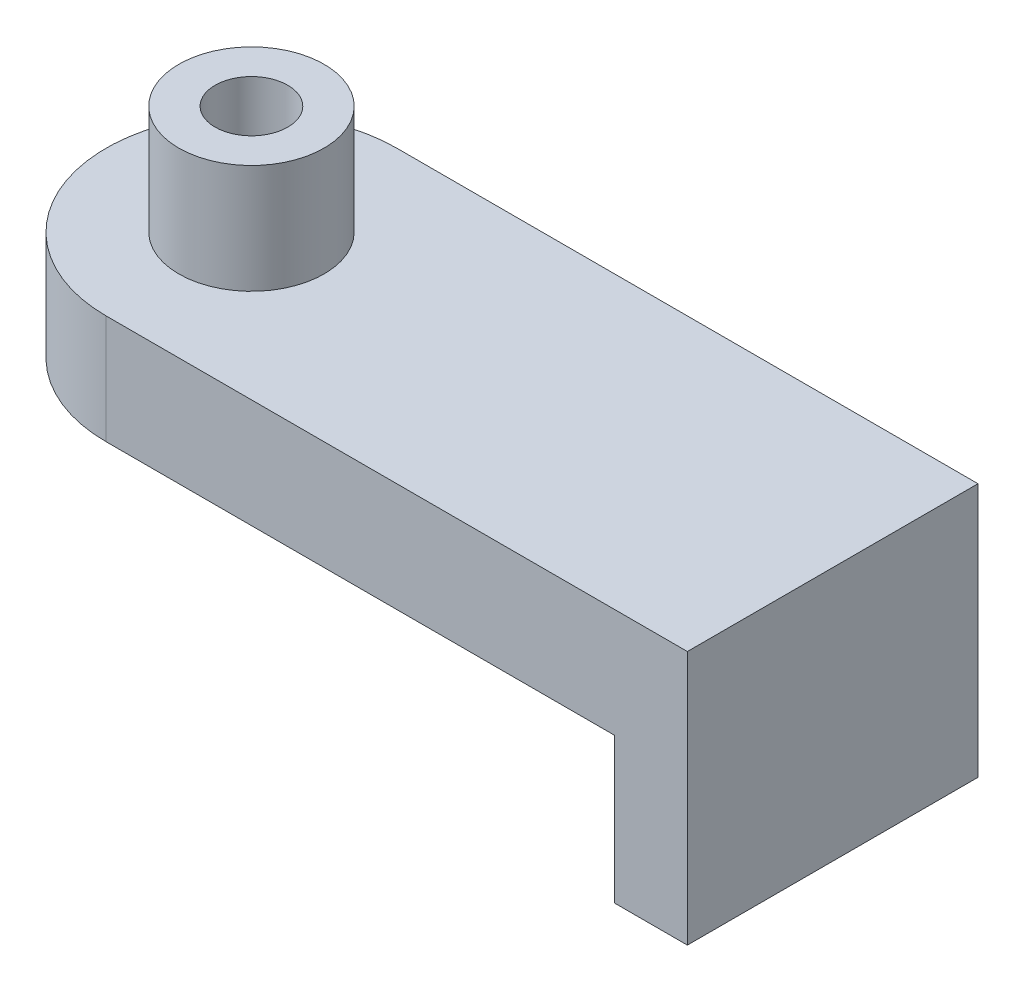
ISO-10303-21;
HEADER;
FILE_DESCRIPTION(('STEP AP214'),'2;1');
FILE_NAME('part.step','',(''),(''),'','','');
FILE_SCHEMA(('AUTOMOTIVE_DESIGN { 1 0 10303 214 1 1 1 1 }'));
ENDSEC;
DATA;
#1=APPLICATION_CONTEXT('core data for automotive mechanical design processes');
#2=APPLICATION_PROTOCOL_DEFINITION('international standard','automotive_design',2000,#1);
#3=PRODUCT_CONTEXT('',#1,'mechanical');
#4=PRODUCT('Part','Part','',(#3));
#5=PRODUCT_RELATED_PRODUCT_CATEGORY('part','',(#4));
#6=PRODUCT_DEFINITION_FORMATION('','',#4);
#7=PRODUCT_DEFINITION_CONTEXT('part definition',#1,'design');
#8=PRODUCT_DEFINITION('design','',#6,#7);
#9=PRODUCT_DEFINITION_SHAPE('','',#8);
#10=(LENGTH_UNIT() NAMED_UNIT(*) SI_UNIT(.MILLI.,.METRE.));
#11=(NAMED_UNIT(*) PLANE_ANGLE_UNIT() SI_UNIT($,.RADIAN.));
#12=(NAMED_UNIT(*) SI_UNIT($,.STERADIAN.) SOLID_ANGLE_UNIT());
#13=UNCERTAINTY_MEASURE_WITH_UNIT(LENGTH_MEASURE(1.E-05),#10,'distance_accuracy_value','');
#14=(GEOMETRIC_REPRESENTATION_CONTEXT(3) GLOBAL_UNCERTAINTY_ASSIGNED_CONTEXT((#13)) GLOBAL_UNIT_ASSIGNED_CONTEXT((#10,
#11,#12)) REPRESENTATION_CONTEXT('',''));
#15=CARTESIAN_POINT('',(0.,0.,0.));
#16=DIRECTION('',(0.,0.,1.));
#17=DIRECTION('',(1.,0.,0.));
#18=AXIS2_PLACEMENT_3D('',#15,#16,#17);
#19=CARTESIAN_POINT('',(-40.,0.,0.));
#20=DIRECTION('',(0.,1.,0.));
#21=DIRECTION('',(0.,0.,1.));
#22=AXIS2_PLACEMENT_3D('',#19,#20,#21);
#23=PLANE('',#22);
#24=CARTESIAN_POINT('',(-40.,0.,0.));
#25=DIRECTION('',(0.,1.,0.));
#26=DIRECTION('',(0.,0.,1.));
#27=AXIS2_PLACEMENT_3D('',#24,#25,#26);
#28=CIRCLE('',#27,5.);
#29=CARTESIAN_POINT('',(-40.,0.,5.));
#30=VERTEX_POINT('',#29);
#31=EDGE_CURVE('E133',#30,#30,#28,.T.);
#32=ORIENTED_EDGE('',*,*,#31,.T.);
#33=EDGE_LOOP('',(#32));
#34=FACE_BOUND('',#33,.T.);
#35=DIRECTION('',(0.,0.,-1.));
#36=VECTOR('',#35,1.);
#37=CARTESIAN_POINT('',(30.,0.,20.));
#38=LINE('',#37,#36);
#39=CARTESIAN_POINT('',(30.,0.,20.));
#40=VERTEX_POINT('',#39);
#41=CARTESIAN_POINT('',(30.,0.,-20.));
#42=VERTEX_POINT('',#41);
#43=EDGE_CURVE('E52',#40,#42,#38,.T.);
#44=ORIENTED_EDGE('',*,*,#43,.F.);
#45=DIRECTION('',(1.,0.,0.));
#46=VECTOR('',#45,1.);
#47=CARTESIAN_POINT('',(-40.,0.,20.));
#48=LINE('',#47,#46);
#49=CARTESIAN_POINT('',(-40.,0.,20.));
#50=VERTEX_POINT('',#49);
#51=EDGE_CURVE('E147',#50,#40,#48,.T.);
#52=ORIENTED_EDGE('',*,*,#51,.F.);
#53=CARTESIAN_POINT('',(-40.,0.,0.));
#54=DIRECTION('',(0.,1.,0.));
#55=DIRECTION('',(0.,0.,1.));
#56=AXIS2_PLACEMENT_3D('',#53,#54,#55);
#57=CIRCLE('',#56,20.);
#58=CARTESIAN_POINT('',(-40.,0.,-20.));
#59=VERTEX_POINT('',#58);
#60=EDGE_CURVE('E138',#59,#50,#57,.T.);
#61=ORIENTED_EDGE('',*,*,#60,.F.);
#62=DIRECTION('',(-1.,0.,0.));
#63=VECTOR('',#62,1.);
#64=CARTESIAN_POINT('',(-40.,0.,-20.));
#65=LINE('',#64,#63);
#66=EDGE_CURVE('E74',#42,#59,#65,.T.);
#67=ORIENTED_EDGE('',*,*,#66,.F.);
#68=EDGE_LOOP('',(#44,#52,#61,#67));
#69=FACE_BOUND('',#68,.T.);
#70=ADVANCED_FACE('F37',(#34,#69),#23,.F.);
#71=CARTESIAN_POINT('',(-40.,15.,0.));
#72=DIRECTION('',(0.,1.,0.));
#73=DIRECTION('',(0.,0.,1.));
#74=AXIS2_PLACEMENT_3D('',#71,#72,#73);
#75=PLANE('',#74);
#76=CARTESIAN_POINT('',(-40.,15.,0.));
#77=DIRECTION('',(0.,1.,0.));
#78=DIRECTION('',(0.,0.,1.));
#79=AXIS2_PLACEMENT_3D('',#76,#77,#78);
#80=CIRCLE('',#79,20.);
#81=CARTESIAN_POINT('',(-40.,15.,-20.));
#82=VERTEX_POINT('',#81);
#83=CARTESIAN_POINT('',(-40.,15.,20.));
#84=VERTEX_POINT('',#83);
#85=EDGE_CURVE('E139',#82,#84,#80,.T.);
#86=ORIENTED_EDGE('',*,*,#85,.T.);
#87=DIRECTION('',(1.,0.,0.));
#88=VECTOR('',#87,1.);
#89=CARTESIAN_POINT('',(-40.,15.,20.));
#90=LINE('',#89,#88);
#91=CARTESIAN_POINT('',(40.,15.,20.));
#92=VERTEX_POINT('',#91);
#93=EDGE_CURVE('E81',#84,#92,#90,.T.);
#94=ORIENTED_EDGE('',*,*,#93,.T.);
#95=DIRECTION('',(0.,0.,-1.));
#96=VECTOR('',#95,1.);
#97=CARTESIAN_POINT('',(40.,15.,-20.));
#98=LINE('',#97,#96);
#99=CARTESIAN_POINT('',(40.,15.,-20.));
#100=VERTEX_POINT('',#99);
#101=EDGE_CURVE('E103',#92,#100,#98,.T.);
#102=ORIENTED_EDGE('',*,*,#101,.T.);
#103=DIRECTION('',(-1.,0.,0.));
#104=VECTOR('',#103,1.);
#105=CARTESIAN_POINT('',(-40.,15.,-20.));
#106=LINE('',#105,#104);
#107=EDGE_CURVE('E61',#100,#82,#106,.T.);
#108=ORIENTED_EDGE('',*,*,#107,.T.);
#109=EDGE_LOOP('',(#86,#94,#102,#108));
#110=FACE_BOUND('',#109,.T.);
#111=CARTESIAN_POINT('',(-40.,15.,0.));
#112=DIRECTION('',(0.,1.,0.));
#113=DIRECTION('',(0.,0.,1.));
#114=AXIS2_PLACEMENT_3D('',#111,#112,#113);
#115=CIRCLE('',#114,10.);
#116=CARTESIAN_POINT('',(-40.,15.,10.));
#117=VERTEX_POINT('',#116);
#118=EDGE_CURVE('E129',#117,#117,#115,.T.);
#119=ORIENTED_EDGE('',*,*,#118,.F.);
#120=EDGE_LOOP('',(#119));
#121=FACE_BOUND('',#120,.T.);
#122=ADVANCED_FACE('F156',(#110,#121),#75,.T.);
#123=CARTESIAN_POINT('',(-40.,15.,0.));
#124=DIRECTION('',(0.,-1.,0.));
#125=DIRECTION('',(0.,0.,-1.));
#126=AXIS2_PLACEMENT_3D('',#123,#124,#125);
#127=CYLINDRICAL_SURFACE('',#126,20.);
#128=ORIENTED_EDGE('',*,*,#60,.T.);
#129=DIRECTION('',(0.,-1.,0.));
#130=VECTOR('',#129,1.);
#131=CARTESIAN_POINT('',(-40.,15.,20.));
#132=LINE('',#131,#130);
#133=EDGE_CURVE('E11',#84,#50,#132,.T.);
#134=ORIENTED_EDGE('',*,*,#133,.F.);
#135=ORIENTED_EDGE('',*,*,#85,.F.);
#136=DIRECTION('',(0.,-1.,0.));
#137=VECTOR('',#136,1.);
#138=CARTESIAN_POINT('',(-40.,15.,-20.));
#139=LINE('',#138,#137);
#140=EDGE_CURVE('E144',#82,#59,#139,.T.);
#141=ORIENTED_EDGE('',*,*,#140,.T.);
#142=EDGE_LOOP('',(#128,#134,#135,#141));
#143=FACE_BOUND('',#142,.T.);
#144=ADVANCED_FACE('F39',(#143),#127,.T.);
#145=CARTESIAN_POINT('',(-40.,15.,20.));
#146=DIRECTION('',(0.,0.,-1.));
#147=DIRECTION('',(-1.,0.,0.));
#148=AXIS2_PLACEMENT_3D('',#145,#146,#147);
#149=PLANE('',#148);
#150=ORIENTED_EDGE('',*,*,#51,.T.);
#151=DIRECTION('',(0.,1.,0.));
#152=VECTOR('',#151,1.);
#153=CARTESIAN_POINT('',(30.,-20.,20.));
#154=LINE('',#153,#152);
#155=CARTESIAN_POINT('',(30.,-20.,20.));
#156=VERTEX_POINT('',#155);
#157=EDGE_CURVE('E109',#156,#40,#154,.T.);
#158=ORIENTED_EDGE('',*,*,#157,.F.);
#159=DIRECTION('',(-1.,0.,0.));
#160=VECTOR('',#159,1.);
#161=CARTESIAN_POINT('',(40.,-20.,20.));
#162=LINE('',#161,#160);
#163=CARTESIAN_POINT('',(40.,-20.,20.));
#164=VERTEX_POINT('',#163);
#165=EDGE_CURVE('E106',#164,#156,#162,.T.);
#166=ORIENTED_EDGE('',*,*,#165,.F.);
#167=DIRECTION('',(0.,-1.,0.));
#168=VECTOR('',#167,1.);
#169=CARTESIAN_POINT('',(40.,15.,20.));
#170=LINE('',#169,#168);
#171=EDGE_CURVE('E45',#92,#164,#170,.T.);
#172=ORIENTED_EDGE('',*,*,#171,.F.);
#173=ORIENTED_EDGE('',*,*,#93,.F.);
#174=ORIENTED_EDGE('',*,*,#133,.T.);
#175=EDGE_LOOP('',(#150,#158,#166,#172,#173,#174));
#176=FACE_BOUND('',#175,.T.);
#177=ADVANCED_FACE('F107',(#176),#149,.F.);
#178=CARTESIAN_POINT('',(40.,15.,-20.));
#179=DIRECTION('',(-1.,0.,0.));
#180=DIRECTION('',(0.,0.,1.));
#181=AXIS2_PLACEMENT_3D('',#178,#179,#180);
#182=PLANE('',#181);
#183=ORIENTED_EDGE('',*,*,#171,.T.);
#184=DIRECTION('',(0.,0.,1.));
#185=VECTOR('',#184,1.);
#186=CARTESIAN_POINT('',(40.,-20.,20.));
#187=LINE('',#186,#185);
#188=CARTESIAN_POINT('',(40.,-20.,-20.));
#189=VERTEX_POINT('',#188);
#190=EDGE_CURVE('E102',#189,#164,#187,.T.);
#191=ORIENTED_EDGE('',*,*,#190,.F.);
#192=DIRECTION('',(0.,-1.,0.));
#193=VECTOR('',#192,1.);
#194=CARTESIAN_POINT('',(40.,15.,-20.));
#195=LINE('',#194,#193);
#196=EDGE_CURVE('E104',#100,#189,#195,.T.);
#197=ORIENTED_EDGE('',*,*,#196,.F.);
#198=ORIENTED_EDGE('',*,*,#101,.F.);
#199=EDGE_LOOP('',(#183,#191,#197,#198));
#200=FACE_BOUND('',#199,.T.);
#201=ADVANCED_FACE('F99',(#200),#182,.F.);
#202=CARTESIAN_POINT('',(-40.,15.,-20.));
#203=DIRECTION('',(0.,0.,1.));
#204=DIRECTION('',(1.,0.,0.));
#205=AXIS2_PLACEMENT_3D('',#202,#203,#204);
#206=PLANE('',#205);
#207=ORIENTED_EDGE('',*,*,#196,.T.);
#208=DIRECTION('',(1.,0.,0.));
#209=VECTOR('',#208,1.);
#210=CARTESIAN_POINT('',(40.,-20.,-20.));
#211=LINE('',#210,#209);
#212=CARTESIAN_POINT('',(30.,-20.,-20.));
#213=VERTEX_POINT('',#212);
#214=EDGE_CURVE('E117',#213,#189,#211,.T.);
#215=ORIENTED_EDGE('',*,*,#214,.F.);
#216=DIRECTION('',(0.,1.,0.));
#217=VECTOR('',#216,1.);
#218=CARTESIAN_POINT('',(30.,-20.,-20.));
#219=LINE('',#218,#217);
#220=EDGE_CURVE('E122',#213,#42,#219,.T.);
#221=ORIENTED_EDGE('',*,*,#220,.T.);
#222=ORIENTED_EDGE('',*,*,#66,.T.);
#223=ORIENTED_EDGE('',*,*,#140,.F.);
#224=ORIENTED_EDGE('',*,*,#107,.F.);
#225=EDGE_LOOP('',(#207,#215,#221,#222,#223,#224));
#226=FACE_BOUND('',#225,.T.);
#227=ADVANCED_FACE('F151',(#226),#206,.F.);
#228=CARTESIAN_POINT('',(-40.,15.,0.));
#229=DIRECTION('',(0.,-1.,0.));
#230=DIRECTION('',(0.,0.,-1.));
#231=AXIS2_PLACEMENT_3D('',#228,#229,#230);
#232=CYLINDRICAL_SURFACE('',#231,5.);
#233=ORIENTED_EDGE('',*,*,#31,.F.);
#234=EDGE_LOOP('',(#233));
#235=FACE_BOUND('',#234,.T.);
#236=CARTESIAN_POINT('',(-40.,30.,0.));
#237=DIRECTION('',(0.,1.,0.));
#238=DIRECTION('',(0.,0.,1.));
#239=AXIS2_PLACEMENT_3D('',#236,#237,#238);
#240=CIRCLE('',#239,5.);
#241=CARTESIAN_POINT('',(-40.,30.,5.));
#242=VERTEX_POINT('',#241);
#243=EDGE_CURVE('E126',#242,#242,#240,.T.);
#244=ORIENTED_EDGE('',*,*,#243,.T.);
#245=EDGE_LOOP('',(#244));
#246=FACE_BOUND('',#245,.T.);
#247=ADVANCED_FACE('F174',(#235,#246),#232,.F.);
#248=CARTESIAN_POINT('',(-40.,30.,0.));
#249=DIRECTION('',(0.,1.,0.));
#250=DIRECTION('',(0.,0.,1.));
#251=AXIS2_PLACEMENT_3D('',#248,#249,#250);
#252=PLANE('',#251);
#253=CARTESIAN_POINT('',(-40.,30.,0.));
#254=DIRECTION('',(0.,1.,0.));
#255=DIRECTION('',(0.,0.,1.));
#256=AXIS2_PLACEMENT_3D('',#253,#254,#255);
#257=CIRCLE('',#256,10.);
#258=CARTESIAN_POINT('',(-40.,30.,10.));
#259=VERTEX_POINT('',#258);
#260=EDGE_CURVE('E130',#259,#259,#257,.T.);
#261=ORIENTED_EDGE('',*,*,#260,.T.);
#262=EDGE_LOOP('',(#261));
#263=FACE_BOUND('',#262,.T.);
#264=ORIENTED_EDGE('',*,*,#243,.F.);
#265=EDGE_LOOP('',(#264));
#266=FACE_BOUND('',#265,.T.);
#267=ADVANCED_FACE('F165',(#263,#266),#252,.T.);
#268=CARTESIAN_POINT('',(-40.,30.,0.));
#269=DIRECTION('',(0.,-1.,0.));
#270=DIRECTION('',(0.,0.,-1.));
#271=AXIS2_PLACEMENT_3D('',#268,#269,#270);
#272=CYLINDRICAL_SURFACE('',#271,10.);
#273=ORIENTED_EDGE('',*,*,#260,.F.);
#274=EDGE_LOOP('',(#273));
#275=FACE_BOUND('',#274,.T.);
#276=ORIENTED_EDGE('',*,*,#118,.T.);
#277=EDGE_LOOP('',(#276));
#278=FACE_BOUND('',#277,.T.);
#279=ADVANCED_FACE('F162',(#275,#278),#272,.T.);
#280=CARTESIAN_POINT('',(30.,-20.,20.));
#281=DIRECTION('',(1.,0.,0.));
#282=DIRECTION('',(0.,0.,-1.));
#283=AXIS2_PLACEMENT_3D('',#280,#281,#282);
#284=PLANE('',#283);
#285=ORIENTED_EDGE('',*,*,#43,.T.);
#286=ORIENTED_EDGE('',*,*,#220,.F.);
#287=DIRECTION('',(0.,0.,-1.));
#288=VECTOR('',#287,1.);
#289=CARTESIAN_POINT('',(30.,-20.,20.));
#290=LINE('',#289,#288);
#291=EDGE_CURVE('E112',#156,#213,#290,.T.);
#292=ORIENTED_EDGE('',*,*,#291,.F.);
#293=ORIENTED_EDGE('',*,*,#157,.T.);
#294=EDGE_LOOP('',(#285,#286,#292,#293));
#295=FACE_BOUND('',#294,.T.);
#296=ADVANCED_FACE('F164',(#295),#284,.F.);
#297=CARTESIAN_POINT('',(0.,-20.,0.));
#298=DIRECTION('',(0.,1.,0.));
#299=DIRECTION('',(0.,0.,1.));
#300=AXIS2_PLACEMENT_3D('',#297,#298,#299);
#301=PLANE('',#300);
#302=ORIENTED_EDGE('',*,*,#190,.T.);
#303=ORIENTED_EDGE('',*,*,#165,.T.);
#304=ORIENTED_EDGE('',*,*,#291,.T.);
#305=ORIENTED_EDGE('',*,*,#214,.T.);
#306=EDGE_LOOP('',(#302,#303,#304,#305));
#307=FACE_BOUND('',#306,.T.);
#308=ADVANCED_FACE('F115',(#307),#301,.F.);
#309=CLOSED_SHELL('',(#70,#122,#144,#177,#201,#227,#247,#267,#279,#296,#308));
#310=MANIFOLD_SOLID_BREP('B2',#309);
#311=ADVANCED_BREP_SHAPE_REPRESENTATION('',(#18,#310),#14);
#312=SHAPE_DEFINITION_REPRESENTATION(#9,#311);
ENDSEC;
END-ISO-10303-21;
